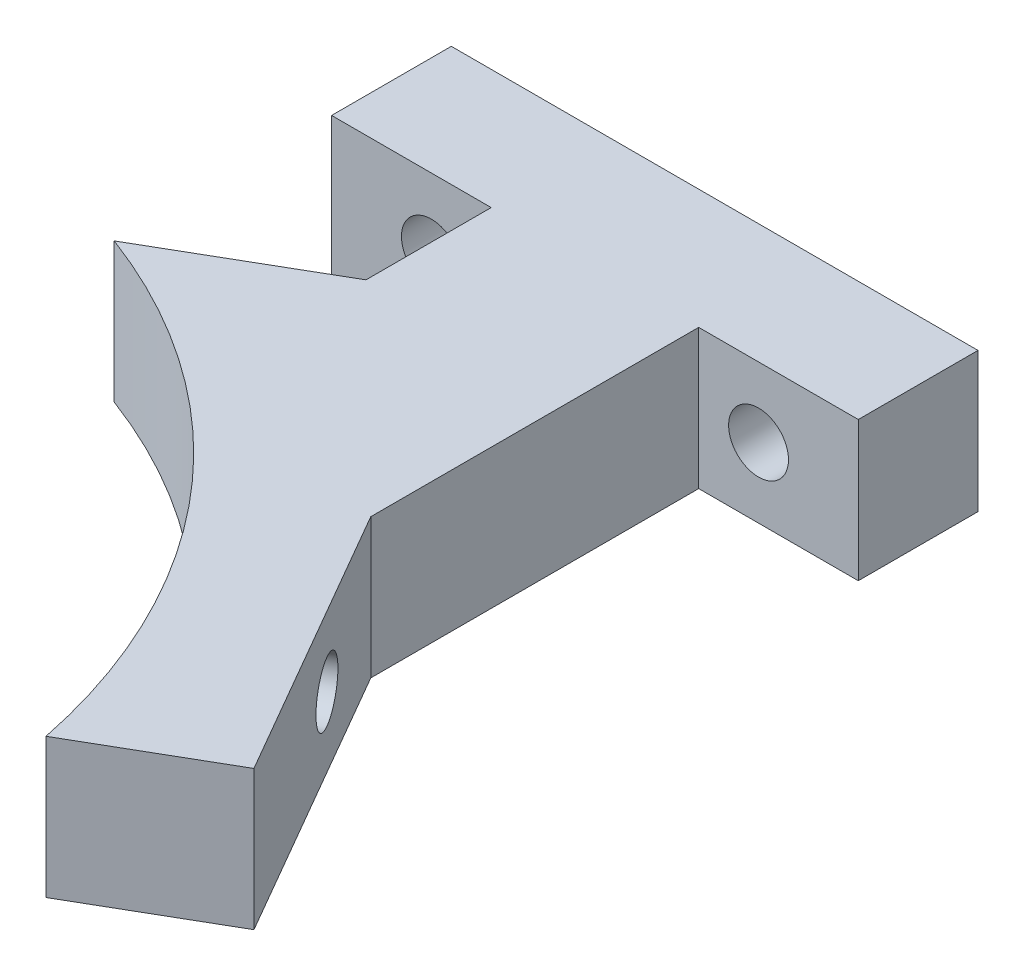
ISO-10303-21;
HEADER;
FILE_DESCRIPTION(('STEP AP214'),'2;1');
FILE_NAME('part.step','',(''),(''),'','','');
FILE_SCHEMA(('AUTOMOTIVE_DESIGN { 1 0 10303 214 1 1 1 1 }'));
ENDSEC;
DATA;
#1=APPLICATION_CONTEXT('core data for automotive mechanical design processes');
#2=APPLICATION_PROTOCOL_DEFINITION('international standard','automotive_design',2000,#1);
#3=PRODUCT_CONTEXT('',#1,'mechanical');
#4=PRODUCT('Part','Part','',(#3));
#5=PRODUCT_RELATED_PRODUCT_CATEGORY('part','',(#4));
#6=PRODUCT_DEFINITION_FORMATION('','',#4);
#7=PRODUCT_DEFINITION_CONTEXT('part definition',#1,'design');
#8=PRODUCT_DEFINITION('design','',#6,#7);
#9=PRODUCT_DEFINITION_SHAPE('','',#8);
#10=(LENGTH_UNIT() NAMED_UNIT(*) SI_UNIT(.MILLI.,.METRE.));
#11=(NAMED_UNIT(*) PLANE_ANGLE_UNIT() SI_UNIT($,.RADIAN.));
#12=(NAMED_UNIT(*) SI_UNIT($,.STERADIAN.) SOLID_ANGLE_UNIT());
#13=UNCERTAINTY_MEASURE_WITH_UNIT(LENGTH_MEASURE(1.E-05),#10,'distance_accuracy_value','');
#14=(GEOMETRIC_REPRESENTATION_CONTEXT(3) GLOBAL_UNCERTAINTY_ASSIGNED_CONTEXT((#13)) GLOBAL_UNIT_ASSIGNED_CONTEXT((#10,
#11,#12)) REPRESENTATION_CONTEXT('',''));
#15=CARTESIAN_POINT('',(0.,0.,0.));
#16=DIRECTION('',(0.,0.,1.));
#17=DIRECTION('',(1.,0.,0.));
#18=AXIS2_PLACEMENT_3D('',#15,#16,#17);
#19=CARTESIAN_POINT('',(32.4759526419165,0.,-18.7499999999999));
#20=DIRECTION('',(0.86602540378444,0.,-0.499999999999998));
#21=DIRECTION('',(-0.499999999999998,0.,-0.86602540378444));
#22=AXIS2_PLACEMENT_3D('',#19,#20,#21);
#23=PLANE('',#22);
#24=CARTESIAN_POINT('',(32.4759526419165,0.,-18.7499999999999));
#25=DIRECTION('',(0.86602540378444,0.,-0.499999999999998));
#26=DIRECTION('',(-0.499999999999998,0.,-0.86602540378444));
#27=AXIS2_PLACEMENT_3D('',#24,#25,#26);
#28=CIRCLE('',#27,1.5);
#29=CARTESIAN_POINT('',(31.7259526419165,0.,-20.0490381056766));
#30=VERTEX_POINT('',#29);
#31=EDGE_CURVE('E239',#30,#30,#28,.T.);
#32=ORIENTED_EDGE('',*,*,#31,.F.);
#33=EDGE_LOOP('',(#32));
#34=FACE_BOUND('',#33,.T.);
#35=DIRECTION('',(-0.499999999999998,0.,-0.86602540378444));
#36=VECTOR('',#35,1.);
#37=CARTESIAN_POINT('',(22.4759526419165,-3.5,-36.0705080756887));
#38=LINE('',#37,#36);
#39=CARTESIAN_POINT('',(37.4759526419165,-3.5,-10.0897459621555));
#40=VERTEX_POINT('',#39);
#41=CARTESIAN_POINT('',(29.4759526419165,-3.5,-23.9461524227066));
#42=VERTEX_POINT('',#41);
#43=EDGE_CURVE('E416',#40,#42,#38,.T.);
#44=ORIENTED_EDGE('',*,*,#43,.T.);
#45=DIRECTION('',(0.,-1.,0.));
#46=VECTOR('',#45,1.);
#47=CARTESIAN_POINT('',(29.4759526419165,3.5,-23.9461524226954));
#48=LINE('',#47,#46);
#49=CARTESIAN_POINT('',(29.4759526419165,3.5,-23.9461524227066));
#50=VERTEX_POINT('',#49);
#51=EDGE_CURVE('E51',#50,#42,#48,.T.);
#52=ORIENTED_EDGE('',*,*,#51,.F.);
#53=DIRECTION('',(0.499999999999998,0.,0.86602540378444));
#54=VECTOR('',#53,1.);
#55=CARTESIAN_POINT('',(22.4759526419165,3.5,-36.0705080756887));
#56=LINE('',#55,#54);
#57=CARTESIAN_POINT('',(37.4759526419165,3.5,-10.0897459621555));
#58=VERTEX_POINT('',#57);
#59=EDGE_CURVE('E233',#50,#58,#56,.T.);
#60=ORIENTED_EDGE('',*,*,#59,.T.);
#61=DIRECTION('',(0.,-1.,0.));
#62=VECTOR('',#61,1.);
#63=CARTESIAN_POINT('',(37.4759526419165,-3.5,-10.0897459621555));
#64=LINE('',#63,#62);
#65=EDGE_CURVE('E238',#58,#40,#64,.T.);
#66=ORIENTED_EDGE('',*,*,#65,.T.);
#67=EDGE_LOOP('',(#44,#52,#60,#66));
#68=FACE_BOUND('',#67,.T.);
#69=ADVANCED_FACE('F34',(#34,#68),#23,.T.);
#70=CARTESIAN_POINT('',(22.4759526419165,-3.5,-36.0705080756887));
#71=DIRECTION('',(0.499999999999998,0.,0.86602540378444));
#72=DIRECTION('',(0.86602540378444,0.,-0.499999999999998));
#73=AXIS2_PLACEMENT_3D('',#70,#71,#72);
#74=PLANE('',#73);
#75=DIRECTION('',(0.,-1.,0.));
#76=VECTOR('',#75,1.);
#77=CARTESIAN_POINT('',(19.0757562141908,3.5,-34.1074037528415));
#78=LINE('',#77,#76);
#79=CARTESIAN_POINT('',(19.0757562141908,3.5,-34.1074037528437));
#80=VERTEX_POINT('',#79);
#81=CARTESIAN_POINT('',(19.0757562141917,-3.5,-34.107403752742));
#82=VERTEX_POINT('',#81);
#83=EDGE_CURVE('E246',#80,#82,#78,.T.);
#84=ORIENTED_EDGE('',*,*,#83,.T.);
#85=DIRECTION('',(-0.86602540378444,0.,0.499999999999998));
#86=VECTOR('',#85,1.);
#87=CARTESIAN_POINT('',(22.4759526419165,-3.5,-36.0705080756887));
#88=LINE('',#87,#86);
#89=CARTESIAN_POINT('',(11.0757562141908,-3.5,-29.4886015993267));
#90=VERTEX_POINT('',#89);
#91=EDGE_CURVE('E418',#82,#90,#88,.T.);
#92=ORIENTED_EDGE('',*,*,#91,.T.);
#93=DIRECTION('',(0.,1.,0.));
#94=VECTOR('',#93,1.);
#95=CARTESIAN_POINT('',(11.0757562141908,-3.5,-29.4886015993267));
#96=LINE('',#95,#94);
#97=CARTESIAN_POINT('',(11.0757562141908,3.5,-29.4886015993267));
#98=VERTEX_POINT('',#97);
#99=EDGE_CURVE('E269',#98,#90,#96,.F.);
#100=ORIENTED_EDGE('',*,*,#99,.F.);
#101=DIRECTION('',(-0.86602540378444,0.,0.499999999999998));
#102=VECTOR('',#101,1.);
#103=CARTESIAN_POINT('',(22.4759526419165,3.5,-36.0705080756887));
#104=LINE('',#103,#102);
#105=EDGE_CURVE('E11',#80,#98,#104,.T.);
#106=ORIENTED_EDGE('',*,*,#105,.F.);
#107=EDGE_LOOP('',(#84,#92,#100,#106));
#108=FACE_BOUND('',#107,.T.);
#109=ADVANCED_FACE('F36',(#108),#74,.F.);
#110=CARTESIAN_POINT('',(22.4759526419165,3.5,-36.0705080756887));
#111=DIRECTION('',(0.,-1.,0.));
#112=DIRECTION('',(0.,0.,-1.));
#113=AXIS2_PLACEMENT_3D('',#110,#111,#112);
#114=PLANE('',#113);
#115=ORIENTED_EDGE('',*,*,#59,.F.);
#116=DIRECTION('',(0.,0.,-1.));
#117=VECTOR('',#116,1.);
#118=CARTESIAN_POINT('',(29.4759526419165,3.5,500000.));
#119=LINE('',#118,#117);
#120=CARTESIAN_POINT('',(29.4759526419165,3.5,-40.3838577540726));
#121=VERTEX_POINT('',#120);
#122=EDGE_CURVE('E235',#50,#121,#119,.T.);
#123=ORIENTED_EDGE('',*,*,#122,.T.);
#124=DIRECTION('',(-1.,0.,0.));
#125=VECTOR('',#124,1.);
#126=CARTESIAN_POINT('',(11.0757562141908,3.5,-40.3838577540726));
#127=LINE('',#126,#125);
#128=CARTESIAN_POINT('',(37.4759526419165,3.5,-40.3838577540726));
#129=VERTEX_POINT('',#128);
#130=EDGE_CURVE('E169',#129,#121,#127,.T.);
#131=ORIENTED_EDGE('',*,*,#130,.F.);
#132=DIRECTION('',(0.,0.,-1.));
#133=VECTOR('',#132,1.);
#134=CARTESIAN_POINT('',(37.4759526419165,3.5,-40.3838577540726));
#135=LINE('',#134,#133);
#136=CARTESIAN_POINT('',(37.4759526419165,3.5,-46.3838577540726));
#137=VERTEX_POINT('',#136);
#138=EDGE_CURVE('E152',#129,#137,#135,.T.);
#139=ORIENTED_EDGE('',*,*,#138,.T.);
#140=DIRECTION('',(-1.,0.,0.));
#141=VECTOR('',#140,1.);
#142=CARTESIAN_POINT('',(11.0757562141908,3.5,-46.3838577540726));
#143=LINE('',#142,#141);
#144=CARTESIAN_POINT('',(11.0757562141908,3.5,-46.3838577540726));
#145=VERTEX_POINT('',#144);
#146=EDGE_CURVE('E140',#137,#145,#143,.T.);
#147=ORIENTED_EDGE('',*,*,#146,.T.);
#148=DIRECTION('',(0.,0.,-1.));
#149=VECTOR('',#148,1.);
#150=CARTESIAN_POINT('',(11.0757562141908,3.5,-40.3838577540726));
#151=LINE('',#150,#149);
#152=CARTESIAN_POINT('',(11.0757562141908,3.5,-40.3838577540726));
#153=VERTEX_POINT('',#152);
#154=EDGE_CURVE('E170',#153,#145,#151,.T.);
#155=ORIENTED_EDGE('',*,*,#154,.F.);
#156=CARTESIAN_POINT('',(19.0757562141908,3.5,-40.3838577540726));
#157=VERTEX_POINT('',#156);
#158=EDGE_CURVE('E136',#157,#153,#127,.T.);
#159=ORIENTED_EDGE('',*,*,#158,.F.);
#160=DIRECTION('',(0.,0.,-1.));
#161=VECTOR('',#160,1.);
#162=CARTESIAN_POINT('',(19.0757562141908,3.5,500000.));
#163=LINE('',#162,#161);
#164=EDGE_CURVE('E244',#80,#157,#163,.T.);
#165=ORIENTED_EDGE('',*,*,#164,.F.);
#166=ORIENTED_EDGE('',*,*,#105,.T.);
#167=CARTESIAN_POINT('',(0.,3.5,0.));
#168=DIRECTION('',(0.,1.,0.));
#169=DIRECTION('',(0.,0.,1.));
#170=AXIS2_PLACEMENT_3D('',#167,#168,#169);
#171=CIRCLE('',#170,31.5);
#172=CARTESIAN_POINT('',(30.8686586432308,3.5,-6.27502299339939));
#173=VERTEX_POINT('',#172);
#174=EDGE_CURVE('E409',#173,#98,#171,.T.);
#175=ORIENTED_EDGE('',*,*,#174,.F.);
#176=DIRECTION('',(-0.86602540378444,0.,0.499999999999998));
#177=VECTOR('',#176,1.);
#178=CARTESIAN_POINT('',(37.4759526419165,3.5,-10.0897459621555));
#179=LINE('',#178,#177);
#180=EDGE_CURVE('E43',#58,#173,#179,.T.);
#181=ORIENTED_EDGE('',*,*,#180,.F.);
#182=EDGE_LOOP('',(#115,#123,#131,#139,#147,#155,#159,#165,#166,#175,#181));
#183=FACE_BOUND('',#182,.T.);
#184=ADVANCED_FACE('F217',(#183),#114,.F.);
#185=CARTESIAN_POINT('',(37.4759526419165,-3.5,-10.0897459621555));
#186=DIRECTION('',(-0.499999999999998,0.,-0.86602540378444));
#187=DIRECTION('',(-0.86602540378444,0.,0.499999999999998));
#188=AXIS2_PLACEMENT_3D('',#185,#186,#187);
#189=PLANE('',#188);
#190=ORIENTED_EDGE('',*,*,#180,.T.);
#191=DIRECTION('',(0.,1.,0.));
#192=VECTOR('',#191,1.);
#193=CARTESIAN_POINT('',(30.8686586432308,-3.5,-6.27502299339939));
#194=LINE('',#193,#192);
#195=CARTESIAN_POINT('',(30.8686586432308,-3.5,-6.27502299339939));
#196=VERTEX_POINT('',#195);
#197=EDGE_CURVE('E260',#196,#173,#194,.T.);
#198=ORIENTED_EDGE('',*,*,#197,.F.);
#199=DIRECTION('',(-0.86602540378444,0.,0.499999999999998));
#200=VECTOR('',#199,1.);
#201=CARTESIAN_POINT('',(37.4759526419165,-3.5,-10.0897459621555));
#202=LINE('',#201,#200);
#203=EDGE_CURVE('E420',#40,#196,#202,.T.);
#204=ORIENTED_EDGE('',*,*,#203,.F.);
#205=ORIENTED_EDGE('',*,*,#65,.F.);
#206=EDGE_LOOP('',(#190,#198,#204,#205));
#207=FACE_BOUND('',#206,.T.);
#208=ADVANCED_FACE('F225',(#207),#189,.F.);
#209=CARTESIAN_POINT('',(22.4759526419165,-3.5,-36.0705080756887));
#210=DIRECTION('',(0.,1.,0.));
#211=DIRECTION('',(0.,0.,1.));
#212=AXIS2_PLACEMENT_3D('',#209,#210,#211);
#213=PLANE('',#212);
#214=ORIENTED_EDGE('',*,*,#203,.T.);
#215=CARTESIAN_POINT('',(0.,-3.5,0.));
#216=DIRECTION('',(0.,-1.,0.));
#217=DIRECTION('',(0.,0.,-1.));
#218=AXIS2_PLACEMENT_3D('',#215,#216,#217);
#219=CIRCLE('',#218,31.5);
#220=EDGE_CURVE('E412',#90,#196,#219,.T.);
#221=ORIENTED_EDGE('',*,*,#220,.F.);
#222=ORIENTED_EDGE('',*,*,#91,.F.);
#223=DIRECTION('',(0.,0.,-1.));
#224=VECTOR('',#223,1.);
#225=CARTESIAN_POINT('',(19.0757562141908,-3.5,500000.));
#226=LINE('',#225,#224);
#227=CARTESIAN_POINT('',(19.0757562141908,-3.5,-40.3838577540726));
#228=VERTEX_POINT('',#227);
#229=EDGE_CURVE('E125',#82,#228,#226,.T.);
#230=ORIENTED_EDGE('',*,*,#229,.T.);
#231=DIRECTION('',(1.,0.,0.));
#232=VECTOR('',#231,1.);
#233=CARTESIAN_POINT('',(11.0757562141908,-3.5,-40.3838577540726));
#234=LINE('',#233,#232);
#235=CARTESIAN_POINT('',(11.0757562141908,-3.5,-40.3838577540726));
#236=VERTEX_POINT('',#235);
#237=EDGE_CURVE('E118',#236,#228,#234,.T.);
#238=ORIENTED_EDGE('',*,*,#237,.F.);
#239=DIRECTION('',(0.,0.,-1.));
#240=VECTOR('',#239,1.);
#241=CARTESIAN_POINT('',(11.0757562141908,-3.5,-40.3838577540726));
#242=LINE('',#241,#240);
#243=CARTESIAN_POINT('',(11.0757562141908,-3.5,-46.3838577540726));
#244=VERTEX_POINT('',#243);
#245=EDGE_CURVE('E122',#236,#244,#242,.T.);
#246=ORIENTED_EDGE('',*,*,#245,.T.);
#247=DIRECTION('',(1.,0.,0.));
#248=VECTOR('',#247,1.);
#249=CARTESIAN_POINT('',(11.0757562141908,-3.5,-46.3838577540726));
#250=LINE('',#249,#248);
#251=CARTESIAN_POINT('',(37.4759526419165,-3.5,-46.3838577540726));
#252=VERTEX_POINT('',#251);
#253=EDGE_CURVE('E179',#244,#252,#250,.T.);
#254=ORIENTED_EDGE('',*,*,#253,.T.);
#255=DIRECTION('',(0.,0.,-1.));
#256=VECTOR('',#255,1.);
#257=CARTESIAN_POINT('',(37.4759526419165,-3.5,-40.3838577540726));
#258=LINE('',#257,#256);
#259=CARTESIAN_POINT('',(37.4759526419165,-3.5,-40.3838577540726));
#260=VERTEX_POINT('',#259);
#261=EDGE_CURVE('E146',#260,#252,#258,.T.);
#262=ORIENTED_EDGE('',*,*,#261,.F.);
#263=CARTESIAN_POINT('',(29.4759526419165,-3.5,-40.3838577540726));
#264=VERTEX_POINT('',#263);
#265=EDGE_CURVE('E129',#264,#260,#234,.T.);
#266=ORIENTED_EDGE('',*,*,#265,.F.);
#267=DIRECTION('',(0.,0.,-1.));
#268=VECTOR('',#267,1.);
#269=CARTESIAN_POINT('',(29.4759526419165,-3.5,500000.));
#270=LINE('',#269,#268);
#271=EDGE_CURVE('E255',#42,#264,#270,.T.);
#272=ORIENTED_EDGE('',*,*,#271,.F.);
#273=ORIENTED_EDGE('',*,*,#43,.F.);
#274=EDGE_LOOP('',(#214,#221,#222,#230,#238,#246,#254,#262,#266,#272,#273));
#275=FACE_BOUND('',#274,.T.);
#276=ADVANCED_FACE('F120',(#275),#213,.F.);
#277=CARTESIAN_POINT('',(32.4759526419165,0.,-18.7499999999999));
#278=DIRECTION('',(-0.86602540378444,0.,0.499999999999998));
#279=DIRECTION('',(0.499999999999998,0.,0.86602540378444));
#280=AXIS2_PLACEMENT_3D('',#277,#278,#279);
#281=CYLINDRICAL_SURFACE('',#280,1.5);
#282=ORIENTED_EDGE('',*,*,#31,.T.);
#283=EDGE_LOOP('',(#282));
#284=FACE_BOUND('',#283,.T.);
#285=CARTESIAN_POINT('',(26.4988531868775,0.,-17.0311708282289));
#286=CARTESIAN_POINT('',(26.4988554618771,-0.0842043948092239,-17.0311678485058));
#287=CARTESIAN_POINT('',(26.502706163581,-0.168468629842511,-17.0251805837171));
#288=CARTESIAN_POINT('',(26.5179885410637,-0.334672901678345,-17.0013668915462));
#289=CARTESIAN_POINT('',(26.5294291670158,-0.416610075269899,-16.9835264866939));
#290=CARTESIAN_POINT('',(26.5594906857329,-0.575728514243859,-16.9364762973977));
#291=CARTESIAN_POINT('',(26.5781079396039,-0.652912166923483,-16.9072722747813));
#292=CARTESIAN_POINT('',(26.6218777306104,-0.800354909991223,-16.8382685372097));
#293=CARTESIAN_POINT('',(26.6470287174425,-0.870615637581481,-16.798471335715));
#294=CARTESIAN_POINT('',(26.703040817852,-1.00230455668159,-16.7092901616993));
#295=CARTESIAN_POINT('',(26.7339065583098,-1.06372551905087,-16.6598984194706));
#296=CARTESIAN_POINT('',(26.8003135160815,-1.17592982220452,-16.5528593858184));
#297=CARTESIAN_POINT('',(26.8358549234643,-1.22671273032763,-16.4952117587795));
#298=CARTESIAN_POINT('',(26.9104807843017,-1.31621858847388,-16.373183364531));
#299=CARTESIAN_POINT('',(26.9495668501138,-1.35493601439227,-16.3087995311584));
#300=CARTESIAN_POINT('',(27.0300382436609,-1.41917637733429,-16.1750769912275));
#301=CARTESIAN_POINT('',(27.0714235551832,-1.44469940738248,-16.1057383196063));
#302=CARTESIAN_POINT('',(27.1551996703821,-1.48180767026685,-15.9640813487696));
#303=CARTESIAN_POINT('',(27.197589679732,-1.49340356235629,-15.8917653721621));
#304=CARTESIAN_POINT('',(27.28216025849,-1.50236127495515,-15.7461366864265));
#305=CARTESIAN_POINT('',(27.3243408294262,-1.49972319946371,-15.6728239845846));
#306=CARTESIAN_POINT('',(27.40726870326,-1.48029672073123,-15.5273509822762));
#307=CARTESIAN_POINT('',(27.4480171405921,-1.46351979303651,-15.4551897955851));
#308=CARTESIAN_POINT('',(27.5270188934005,-1.41630963023021,-15.3140385512893));
#309=CARTESIAN_POINT('',(27.5652721991319,-1.3858763417857,-15.2450485060701));
#310=CARTESIAN_POINT('',(27.6383152293055,-1.31220424921885,-15.1122230287263));
#311=CARTESIAN_POINT('',(27.6731035305534,-1.2689602120351,-15.0483897166632));
#312=CARTESIAN_POINT('',(27.738345636783,-1.17089798873575,-14.9277891789085));
#313=CARTESIAN_POINT('',(27.7687994141582,-1.11607972891008,-14.8710219982211));
#314=CARTESIAN_POINT('',(27.8246860496194,-0.996360264682106,-14.766190657648));
#315=CARTESIAN_POINT('',(27.8501138932258,-0.931449104564676,-14.7181351935432));
#316=CARTESIAN_POINT('',(27.8953365163458,-0.793421422026246,-14.6322439972116));
#317=CARTESIAN_POINT('',(27.9151312944637,-0.720304897572146,-14.594408267517));
#318=CARTESIAN_POINT('',(27.9486552816041,-0.567935994531883,-14.5301063101364));
#319=CARTESIAN_POINT('',(27.9623843164,-0.488683439777032,-14.5036404090273));
#320=CARTESIAN_POINT('',(27.9834823432756,-0.326294873676328,-14.4628920674042));
#321=CARTESIAN_POINT('',(27.990851378746,-0.243158888829025,-14.44860954377));
#322=CARTESIAN_POINT('',(27.9990701642976,-0.0754508132442202,-14.4326765356347));
#323=CARTESIAN_POINT('',(27.9999263094375,0.00911978701157073,-14.4310136598053));
#324=CARTESIAN_POINT('',(27.9951182725825,0.177373285452335,-14.4403386166107));
#325=CARTESIAN_POINT('',(27.9894541101112,0.261056186294588,-14.4513264113657));
#326=CARTESIAN_POINT('',(27.971728514356,0.425119749539235,-14.4856056871607));
#327=CARTESIAN_POINT('',(27.9596700219565,0.505501911723214,-14.5088915120627));
#328=CARTESIAN_POINT('',(27.929413448357,0.660728424727573,-14.5670495536605));
#329=CARTESIAN_POINT('',(27.9112153349778,0.735572746520304,-14.6019218310836));
#330=CARTESIAN_POINT('',(27.8690571940642,0.877663117366538,-14.6822239917823));
#331=CARTESIAN_POINT('',(27.8450926808446,0.944903190916498,-14.7276620932878));
#332=CARTESIAN_POINT('',(27.7919446475588,1.0698162713297,-14.8277109769927));
#333=CARTESIAN_POINT('',(27.7627610970471,1.12748922237888,-14.8823218127017));
#334=CARTESIAN_POINT('',(27.699826791114,1.23167769705715,-14.9991330504297));
#335=CARTESIAN_POINT('',(27.6660723878517,1.27818422609202,-15.0613395103179));
#336=CARTESIAN_POINT('',(27.5948341890675,1.35865822265186,-15.1914653893849));
#337=CARTESIAN_POINT('',(27.5573504086487,1.39262574095431,-15.2593847854273));
#338=CARTESIAN_POINT('',(27.4796243356246,1.44704176394667,-15.3989160644875));
#339=CARTESIAN_POINT('',(27.4393832273422,1.46749603314576,-15.4705263589626));
#340=CARTESIAN_POINT('',(27.3572020386355,1.49432381681446,-15.6153907609933));
#341=CARTESIAN_POINT('',(27.3152619666208,1.50069740097249,-15.6886448604116));
#342=CARTESIAN_POINT('',(27.2308957186939,1.4991822149771,-15.8346272060338));
#343=CARTESIAN_POINT('',(27.188470065203,1.49130756013566,-15.907355901085));
#344=CARTESIAN_POINT('',(27.1043238453157,1.46154859090086,-16.0503118703632));
#345=CARTESIAN_POINT('',(27.0626032802596,1.43966424987962,-16.1205391398356));
#346=CARTESIAN_POINT('',(26.9811240964102,1.38250994265639,-16.2565442871238));
#347=CARTESIAN_POINT('',(26.9413654956209,1.34723985364607,-16.3223221241116));
#348=CARTESIAN_POINT('',(26.8650492684003,1.26431783178765,-16.4476295121881));
#349=CARTESIAN_POINT('',(26.8284915412254,1.21666628881812,-16.5071592599394));
#350=CARTESIAN_POINT('',(26.7597160299958,1.11028399437721,-16.6184201209807));
#351=CARTESIAN_POINT('',(26.7275021004225,1.05154351257538,-16.670144312773));
#352=CARTESIAN_POINT('',(26.6685051767288,0.924655100308074,-16.7643649084442));
#353=CARTESIAN_POINT('',(26.6417235219943,0.856504856708795,-16.8068590367339));
#354=CARTESIAN_POINT('',(26.594481930507,0.712681791724393,-16.8815132752777));
#355=CARTESIAN_POINT('',(26.5740277942128,0.637002151594976,-16.9136639046829));
#356=CARTESIAN_POINT('',(26.5401959897501,0.480374331342326,-16.9667025612091));
#357=CARTESIAN_POINT('',(26.52680995163,0.399432510833651,-16.9876039101534));
#358=CARTESIAN_POINT('',(26.5110966730444,0.26498879245262,-17.0121095407784));
#359=CARTESIAN_POINT('',(26.5065123042031,0.212357992745769,-17.019249045646));
#360=CARTESIAN_POINT('',(26.5003898428397,0.106492774590437,-17.0287806298594));
#361=CARTESIAN_POINT('',(26.4988517479652,0.0532583566081141,-17.0311727128711));
#362=CARTESIAN_POINT('',(26.4988531868775,0.,-17.0311708282289));
#363=B_SPLINE_CURVE_WITH_KNOTS('',3,(#285,#286,#287,#288,#289,#290,#291,#292,#293,#294,#295,
#296,#297,#298,#299,#300,#301,#302,#303,#304,#305,#306,#307,#308,#309,#310,#311,#312,#313,#314,
#315,#316,#317,#318,#319,#320,#321,#322,#323,#324,#325,#326,#327,#328,#329,#330,#331,#332,#333,
#334,#335,#336,#337,#338,#339,#340,#341,#342,#343,#344,#345,#346,#347,#348,#349,#350,#351,#352,
#353,#354,#355,#356,#357,#358,#359,#360,#361,#362),.UNSPECIFIED.,.T.,.F.,(4,2,2,2,2,2,2,2,2,2,2,
2,2,2,2,2,2,2,2,2,2,2,2,2,2,2,2,2,2,2,2,2,2,2,2,2,2,2,4),(0.,0.252418772914019,
0.505135732869888,0.757724721427068,1.01025383113121,1.26298829917882,1.51573304421801,
1.76859333740449,2.02145184782356,2.27411670725812,2.5267797206231,2.77923786185179,
3.03169698902736,3.28425938574244,3.53682339094164,3.78963812647859,4.04245292465733,
4.29527498397667,4.54809531841898,4.80066737448786,5.05323867428271,5.30569391193885,
5.55815047279371,5.81080405825838,6.0634591176384,6.31631701393423,6.56917388625547,
6.82192282461287,7.07467051205711,7.32716794686795,7.57966586159614,7.83216609293751,
8.08465837428378,8.33737325135336,8.59015036246668,8.84315851324809,9.09586637923702,
9.25551860919666,9.41517071586989),.UNSPECIFIED.);
#364=CARTESIAN_POINT('',(26.4988531868775,0.,-17.0311708282289));
#365=VERTEX_POINT('',#364);
#366=EDGE_CURVE('E263',#365,#365,#363,.T.);
#367=ORIENTED_EDGE('',*,*,#366,.T.);
#368=EDGE_LOOP('',(#367));
#369=FACE_BOUND('',#368,.T.);
#370=ADVANCED_FACE('F221',(#284,#369),#281,.F.);
#371=CARTESIAN_POINT('',(0.,-3.5,0.));
#372=DIRECTION('',(0.,1.,0.));
#373=DIRECTION('',(0.,0.,1.));
#374=AXIS2_PLACEMENT_3D('',#371,#372,#373);
#375=CYLINDRICAL_SURFACE('',#374,31.5);
#376=ORIENTED_EDGE('',*,*,#197,.T.);
#377=ORIENTED_EDGE('',*,*,#174,.T.);
#378=ORIENTED_EDGE('',*,*,#99,.T.);
#379=ORIENTED_EDGE('',*,*,#220,.T.);
#380=EDGE_LOOP('',(#376,#377,#378,#379));
#381=FACE_BOUND('',#380,.T.);
#382=ORIENTED_EDGE('',*,*,#366,.F.);
#383=EDGE_LOOP('',(#382));
#384=FACE_BOUND('',#383,.T.);
#385=ADVANCED_FACE('F272',(#381,#384),#375,.F.);
#386=CARTESIAN_POINT('',(29.4759526419165,3.5,500000.));
#387=DIRECTION('',(-1.,0.,0.));
#388=DIRECTION('',(0.,0.,1.));
#389=AXIS2_PLACEMENT_3D('',#386,#387,#388);
#390=PLANE('',#389);
#391=ORIENTED_EDGE('',*,*,#122,.F.);
#392=ORIENTED_EDGE('',*,*,#51,.T.);
#393=ORIENTED_EDGE('',*,*,#271,.T.);
#394=DIRECTION('',(0.,1.,0.));
#395=VECTOR('',#394,1.);
#396=CARTESIAN_POINT('',(29.4759526419165,3.5,-40.3838577540726));
#397=LINE('',#396,#395);
#398=EDGE_CURVE('E145',#264,#121,#397,.T.);
#399=ORIENTED_EDGE('',*,*,#398,.T.);
#400=EDGE_LOOP('',(#391,#392,#393,#399));
#401=FACE_BOUND('',#400,.T.);
#402=ADVANCED_FACE('F209',(#401),#390,.F.);
#403=CARTESIAN_POINT('',(19.0757562141908,3.5,500000.));
#404=DIRECTION('',(1.,0.,0.));
#405=DIRECTION('',(0.,0.,-1.));
#406=AXIS2_PLACEMENT_3D('',#403,#404,#405);
#407=PLANE('',#406);
#408=ORIENTED_EDGE('',*,*,#83,.F.);
#409=ORIENTED_EDGE('',*,*,#164,.T.);
#410=DIRECTION('',(0.,-1.,0.));
#411=VECTOR('',#410,1.);
#412=CARTESIAN_POINT('',(19.0757562141908,3.5,-40.3838577540726));
#413=LINE('',#412,#411);
#414=EDGE_CURVE('E149',#157,#228,#413,.T.);
#415=ORIENTED_EDGE('',*,*,#414,.T.);
#416=ORIENTED_EDGE('',*,*,#229,.F.);
#417=EDGE_LOOP('',(#408,#409,#415,#416));
#418=FACE_BOUND('',#417,.T.);
#419=ADVANCED_FACE('F208',(#418),#407,.F.);
#420=CARTESIAN_POINT('',(0.,0.,-40.3838577540726));
#421=DIRECTION('',(0.,0.,-1.));
#422=DIRECTION('',(-1.,0.,0.));
#423=AXIS2_PLACEMENT_3D('',#420,#421,#422);
#424=PLANE('',#423);
#425=ORIENTED_EDGE('',*,*,#398,.F.);
#426=ORIENTED_EDGE('',*,*,#265,.T.);
#427=DIRECTION('',(0.,1.,0.));
#428=VECTOR('',#427,1.);
#429=CARTESIAN_POINT('',(37.4759526419165,-3.5,-40.3838577540726));
#430=LINE('',#429,#428);
#431=EDGE_CURVE('E128',#260,#129,#430,.T.);
#432=ORIENTED_EDGE('',*,*,#431,.T.);
#433=ORIENTED_EDGE('',*,*,#130,.T.);
#434=EDGE_LOOP('',(#425,#426,#432,#433));
#435=FACE_BOUND('',#434,.T.);
#436=CARTESIAN_POINT('',(32.4759526419165,0.,-40.3838577540726));
#437=DIRECTION('',(0.,0.,1.));
#438=DIRECTION('',(1.,0.,0.));
#439=AXIS2_PLACEMENT_3D('',#436,#437,#438);
#440=CIRCLE('',#439,1.5);
#441=CARTESIAN_POINT('',(33.9759526419165,0.,-40.3838577540726));
#442=VERTEX_POINT('',#441);
#443=EDGE_CURVE('E181',#442,#442,#440,.T.);
#444=ORIENTED_EDGE('',*,*,#443,.F.);
#445=EDGE_LOOP('',(#444));
#446=FACE_BOUND('',#445,.T.);
#447=ADVANCED_FACE('F200',(#435,#446),#424,.F.);
#448=ORIENTED_EDGE('',*,*,#414,.F.);
#449=ORIENTED_EDGE('',*,*,#158,.T.);
#450=DIRECTION('',(0.,-1.,0.));
#451=VECTOR('',#450,1.);
#452=CARTESIAN_POINT('',(11.0757562141908,-3.5,-40.3838577540726));
#453=LINE('',#452,#451);
#454=EDGE_CURVE('E132',#153,#236,#453,.T.);
#455=ORIENTED_EDGE('',*,*,#454,.T.);
#456=ORIENTED_EDGE('',*,*,#237,.T.);
#457=EDGE_LOOP('',(#448,#449,#455,#456));
#458=FACE_BOUND('',#457,.T.);
#459=CARTESIAN_POINT('',(16.0757562141908,0.,-40.3838577540726));
#460=DIRECTION('',(0.,0.,1.));
#461=DIRECTION('',(1.,0.,0.));
#462=AXIS2_PLACEMENT_3D('',#459,#460,#461);
#463=CIRCLE('',#462,1.5);
#464=CARTESIAN_POINT('',(17.5757562141908,0.,-40.3838577540726));
#465=VERTEX_POINT('',#464);
#466=EDGE_CURVE('E188',#465,#465,#463,.T.);
#467=ORIENTED_EDGE('',*,*,#466,.F.);
#468=EDGE_LOOP('',(#467));
#469=FACE_BOUND('',#468,.T.);
#470=ADVANCED_FACE('F133',(#458,#469),#424,.F.);
#471=CARTESIAN_POINT('',(0.,0.,-46.3838577540726));
#472=DIRECTION('',(0.,0.,-1.));
#473=DIRECTION('',(-1.,0.,0.));
#474=AXIS2_PLACEMENT_3D('',#471,#472,#473);
#475=PLANE('',#474);
#476=CARTESIAN_POINT('',(32.4759526419165,0.,-46.3838577540726));
#477=DIRECTION('',(0.,0.,1.));
#478=DIRECTION('',(1.,0.,0.));
#479=AXIS2_PLACEMENT_3D('',#476,#477,#478);
#480=CIRCLE('',#479,1.5);
#481=CARTESIAN_POINT('',(33.9759526419165,0.,-46.3838577540726));
#482=VERTEX_POINT('',#481);
#483=EDGE_CURVE('E183',#482,#482,#480,.T.);
#484=ORIENTED_EDGE('',*,*,#483,.T.);
#485=EDGE_LOOP('',(#484));
#486=FACE_BOUND('',#485,.T.);
#487=DIRECTION('',(0.,-1.,0.));
#488=VECTOR('',#487,1.);
#489=CARTESIAN_POINT('',(11.0757562141908,-3.5,-46.3838577540726));
#490=LINE('',#489,#488);
#491=EDGE_CURVE('E144',#145,#244,#490,.T.);
#492=ORIENTED_EDGE('',*,*,#491,.F.);
#493=ORIENTED_EDGE('',*,*,#146,.F.);
#494=DIRECTION('',(0.,1.,0.));
#495=VECTOR('',#494,1.);
#496=CARTESIAN_POINT('',(37.4759526419165,-3.5,-46.3838577540726));
#497=LINE('',#496,#495);
#498=EDGE_CURVE('E178',#252,#137,#497,.T.);
#499=ORIENTED_EDGE('',*,*,#498,.F.);
#500=ORIENTED_EDGE('',*,*,#253,.F.);
#501=EDGE_LOOP('',(#492,#493,#499,#500));
#502=FACE_BOUND('',#501,.T.);
#503=CARTESIAN_POINT('',(16.0757562141908,0.,-46.3838577540726));
#504=DIRECTION('',(0.,0.,1.));
#505=DIRECTION('',(1.,0.,0.));
#506=AXIS2_PLACEMENT_3D('',#503,#504,#505);
#507=CIRCLE('',#506,1.5);
#508=CARTESIAN_POINT('',(17.5757562141908,0.,-46.3838577540726));
#509=VERTEX_POINT('',#508);
#510=EDGE_CURVE('E190',#509,#509,#507,.T.);
#511=ORIENTED_EDGE('',*,*,#510,.T.);
#512=EDGE_LOOP('',(#511));
#513=FACE_BOUND('',#512,.T.);
#514=ADVANCED_FACE('F199',(#486,#502,#513),#475,.T.);
#515=CARTESIAN_POINT('',(11.0757562141908,-3.5,-40.3838577540726));
#516=DIRECTION('',(1.,0.,0.));
#517=DIRECTION('',(0.,0.,-1.));
#518=AXIS2_PLACEMENT_3D('',#515,#516,#517);
#519=PLANE('',#518);
#520=ORIENTED_EDGE('',*,*,#491,.T.);
#521=ORIENTED_EDGE('',*,*,#245,.F.);
#522=ORIENTED_EDGE('',*,*,#454,.F.);
#523=ORIENTED_EDGE('',*,*,#154,.T.);
#524=EDGE_LOOP('',(#520,#521,#522,#523));
#525=FACE_BOUND('',#524,.T.);
#526=ADVANCED_FACE('F142',(#525),#519,.F.);
#527=CARTESIAN_POINT('',(37.4759526419165,-3.5,-40.3838577540726));
#528=DIRECTION('',(-1.,0.,0.));
#529=DIRECTION('',(0.,0.,1.));
#530=AXIS2_PLACEMENT_3D('',#527,#528,#529);
#531=PLANE('',#530);
#532=ORIENTED_EDGE('',*,*,#498,.T.);
#533=ORIENTED_EDGE('',*,*,#138,.F.);
#534=ORIENTED_EDGE('',*,*,#431,.F.);
#535=ORIENTED_EDGE('',*,*,#261,.T.);
#536=EDGE_LOOP('',(#532,#533,#534,#535));
#537=FACE_BOUND('',#536,.T.);
#538=ADVANCED_FACE('F284',(#537),#531,.F.);
#539=CARTESIAN_POINT('',(32.4759526419165,0.,-40.3838577540726));
#540=DIRECTION('',(0.,0.,-1.));
#541=DIRECTION('',(-1.,0.,0.));
#542=AXIS2_PLACEMENT_3D('',#539,#540,#541);
#543=CYLINDRICAL_SURFACE('',#542,1.5);
#544=ORIENTED_EDGE('',*,*,#443,.T.);
#545=EDGE_LOOP('',(#544));
#546=FACE_BOUND('',#545,.T.);
#547=ORIENTED_EDGE('',*,*,#483,.F.);
#548=EDGE_LOOP('',(#547));
#549=FACE_BOUND('',#548,.T.);
#550=ADVANCED_FACE('F286',(#546,#549),#543,.F.);
#551=CARTESIAN_POINT('',(16.0757562141908,0.,-40.3838577540726));
#552=DIRECTION('',(0.,0.,-1.));
#553=DIRECTION('',(-1.,0.,0.));
#554=AXIS2_PLACEMENT_3D('',#551,#552,#553);
#555=CYLINDRICAL_SURFACE('',#554,1.5);
#556=ORIENTED_EDGE('',*,*,#466,.T.);
#557=EDGE_LOOP('',(#556));
#558=FACE_BOUND('',#557,.T.);
#559=ORIENTED_EDGE('',*,*,#510,.F.);
#560=EDGE_LOOP('',(#559));
#561=FACE_BOUND('',#560,.T.);
#562=ADVANCED_FACE('F196',(#558,#561),#555,.F.);
#563=CLOSED_SHELL('',(#69,#109,#184,#208,#276,#370,#385,#402,#419,#447,#470,#514,#526,#538,#550,#562));
#564=MANIFOLD_SOLID_BREP('B2',#563);
#565=ADVANCED_BREP_SHAPE_REPRESENTATION('',(#18,#564),#14);
#566=SHAPE_DEFINITION_REPRESENTATION(#9,#565);
ENDSEC;
END-ISO-10303-21;
